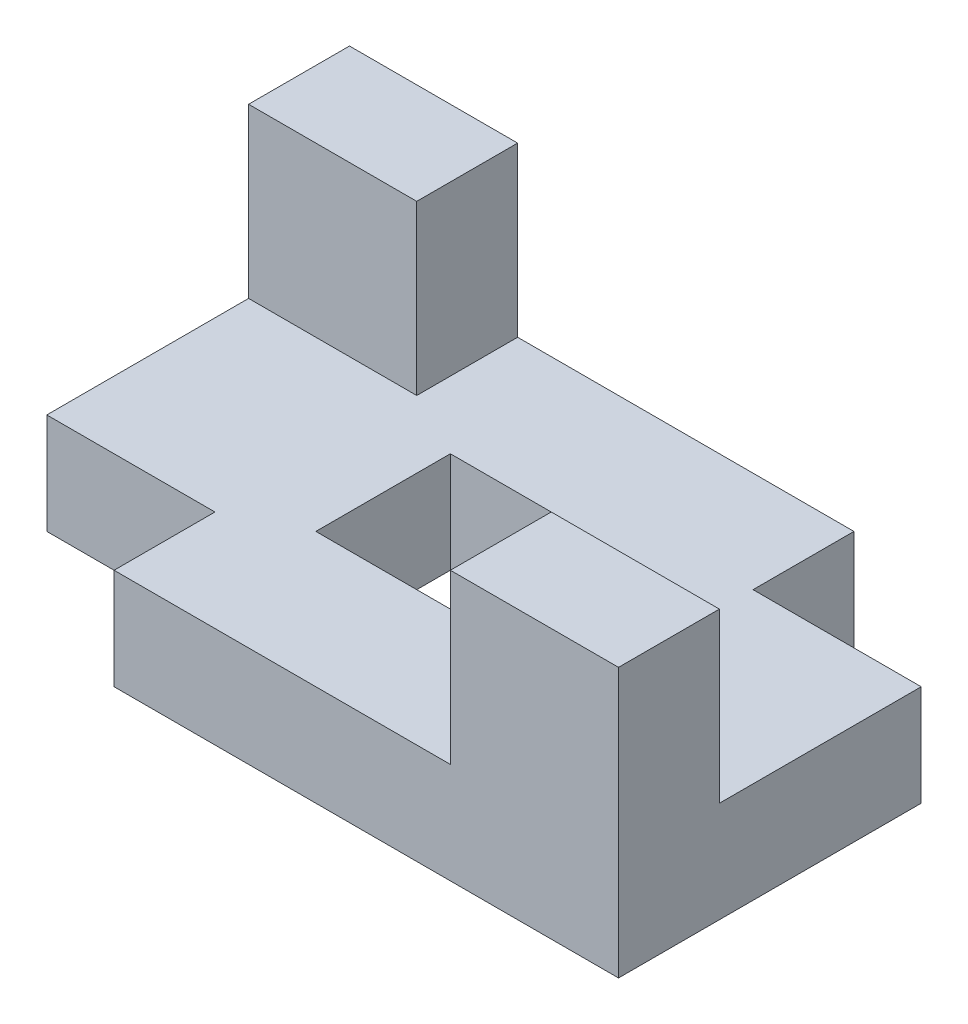
ISO-10303-21;
HEADER;
FILE_DESCRIPTION(('STEP AP214'),'2;1');
FILE_NAME('part.step','',(''),(''),'','','');
FILE_SCHEMA(('AUTOMOTIVE_DESIGN { 1 0 10303 214 1 1 1 1 }'));
ENDSEC;
DATA;
#1=APPLICATION_CONTEXT('core data for automotive mechanical design processes');
#2=APPLICATION_PROTOCOL_DEFINITION('international standard','automotive_design',2000,#1);
#3=PRODUCT_CONTEXT('',#1,'mechanical');
#4=PRODUCT('Part','Part','',(#3));
#5=PRODUCT_RELATED_PRODUCT_CATEGORY('part','',(#4));
#6=PRODUCT_DEFINITION_FORMATION('','',#4);
#7=PRODUCT_DEFINITION_CONTEXT('part definition',#1,'design');
#8=PRODUCT_DEFINITION('design','',#6,#7);
#9=PRODUCT_DEFINITION_SHAPE('','',#8);
#10=(LENGTH_UNIT() NAMED_UNIT(*) SI_UNIT(.MILLI.,.METRE.));
#11=(NAMED_UNIT(*) PLANE_ANGLE_UNIT() SI_UNIT($,.RADIAN.));
#12=(NAMED_UNIT(*) SI_UNIT($,.STERADIAN.) SOLID_ANGLE_UNIT());
#13=UNCERTAINTY_MEASURE_WITH_UNIT(LENGTH_MEASURE(1.E-05),#10,'distance_accuracy_value','');
#14=(GEOMETRIC_REPRESENTATION_CONTEXT(3) GLOBAL_UNCERTAINTY_ASSIGNED_CONTEXT((#13)) GLOBAL_UNIT_ASSIGNED_CONTEXT((#10,
#11,#12)) REPRESENTATION_CONTEXT('',''));
#15=CARTESIAN_POINT('',(0.,0.,0.));
#16=DIRECTION('',(0.,0.,1.));
#17=DIRECTION('',(1.,0.,0.));
#18=AXIS2_PLACEMENT_3D('',#15,#16,#17);
#19=CARTESIAN_POINT('',(-50.,15.,-30.));
#20=DIRECTION('',(1.,0.,0.));
#21=DIRECTION('',(0.,0.,-1.));
#22=AXIS2_PLACEMENT_3D('',#19,#20,#21);
#23=PLANE('',#22);
#24=DIRECTION('',(0.,0.,1.));
#25=VECTOR('',#24,1.);
#26=CARTESIAN_POINT('',(-50.,0.,-30.));
#27=LINE('',#26,#25);
#28=CARTESIAN_POINT('',(-50.,0.,-30.));
#29=VERTEX_POINT('',#28);
#30=CARTESIAN_POINT('',(-50.,0.,15.));
#31=VERTEX_POINT('',#30);
#32=EDGE_CURVE('E304',#29,#31,#27,.T.);
#33=ORIENTED_EDGE('',*,*,#32,.T.);
#34=DIRECTION('',(0.,1.,0.));
#35=VECTOR('',#34,1.);
#36=CARTESIAN_POINT('',(-50.,0.,15.));
#37=LINE('',#36,#35);
#38=CARTESIAN_POINT('',(-50.,15.,15.));
#39=VERTEX_POINT('',#38);
#40=EDGE_CURVE('E236',#31,#39,#37,.T.);
#41=ORIENTED_EDGE('',*,*,#40,.T.);
#42=DIRECTION('',(0.,0.,1.));
#43=VECTOR('',#42,1.);
#44=CARTESIAN_POINT('',(-50.,15.,-30.));
#45=LINE('',#44,#43);
#46=CARTESIAN_POINT('',(-50.,15.,-15.));
#47=VERTEX_POINT('',#46);
#48=EDGE_CURVE('E337',#47,#39,#45,.T.);
#49=ORIENTED_EDGE('',*,*,#48,.F.);
#50=DIRECTION('',(0.,-1.,0.));
#51=VECTOR('',#50,1.);
#52=CARTESIAN_POINT('',(-50.,40.,-15.));
#53=LINE('',#52,#51);
#54=CARTESIAN_POINT('',(-50.,40.,-15.));
#55=VERTEX_POINT('',#54);
#56=EDGE_CURVE('E300',#55,#47,#53,.T.);
#57=ORIENTED_EDGE('',*,*,#56,.F.);
#58=DIRECTION('',(0.,0.,1.));
#59=VECTOR('',#58,1.);
#60=CARTESIAN_POINT('',(-50.,40.,-30.));
#61=LINE('',#60,#59);
#62=CARTESIAN_POINT('',(-50.,40.,-30.));
#63=VERTEX_POINT('',#62);
#64=EDGE_CURVE('E269',#63,#55,#61,.T.);
#65=ORIENTED_EDGE('',*,*,#64,.F.);
#66=DIRECTION('',(0.,-1.,0.));
#67=VECTOR('',#66,1.);
#68=CARTESIAN_POINT('',(-50.,15.,-30.));
#69=LINE('',#68,#67);
#70=EDGE_CURVE('E53',#63,#29,#69,.T.);
#71=ORIENTED_EDGE('',*,*,#70,.T.);
#72=EDGE_LOOP('',(#33,#41,#49,#57,#65,#71));
#73=FACE_BOUND('',#72,.T.);
#74=ADVANCED_FACE('F45',(#73),#23,.F.);
#75=CARTESIAN_POINT('',(-50.,15.,30.));
#76=DIRECTION('',(0.,0.,-1.));
#77=DIRECTION('',(-1.,0.,0.));
#78=AXIS2_PLACEMENT_3D('',#75,#76,#77);
#79=PLANE('',#78);
#80=DIRECTION('',(1.,0.,0.));
#81=VECTOR('',#80,1.);
#82=CARTESIAN_POINT('',(-50.,15.,30.));
#83=LINE('',#82,#81);
#84=CARTESIAN_POINT('',(-25.,15.,30.));
#85=VERTEX_POINT('',#84);
#86=CARTESIAN_POINT('',(25.,15.,30.));
#87=VERTEX_POINT('',#86);
#88=EDGE_CURVE('E341',#85,#87,#83,.T.);
#89=ORIENTED_EDGE('',*,*,#88,.F.);
#90=DIRECTION('',(0.,1.,0.));
#91=VECTOR('',#90,1.);
#92=CARTESIAN_POINT('',(-25.,0.,30.));
#93=LINE('',#92,#91);
#94=CARTESIAN_POINT('',(-25.,0.,30.));
#95=VERTEX_POINT('',#94);
#96=EDGE_CURVE('E228',#95,#85,#93,.T.);
#97=ORIENTED_EDGE('',*,*,#96,.F.);
#98=DIRECTION('',(1.,0.,0.));
#99=VECTOR('',#98,1.);
#100=CARTESIAN_POINT('',(-50.,0.,30.));
#101=LINE('',#100,#99);
#102=CARTESIAN_POINT('',(50.,0.,30.));
#103=VERTEX_POINT('',#102);
#104=EDGE_CURVE('E355',#95,#103,#101,.T.);
#105=ORIENTED_EDGE('',*,*,#104,.T.);
#106=DIRECTION('',(0.,-1.,0.));
#107=VECTOR('',#106,1.);
#108=CARTESIAN_POINT('',(50.,15.,30.));
#109=LINE('',#108,#107);
#110=CARTESIAN_POINT('',(50.,40.,30.));
#111=VERTEX_POINT('',#110);
#112=EDGE_CURVE('E11',#111,#103,#109,.T.);
#113=ORIENTED_EDGE('',*,*,#112,.F.);
#114=DIRECTION('',(1.,0.,0.));
#115=VECTOR('',#114,1.);
#116=CARTESIAN_POINT('',(50.,40.,30.));
#117=LINE('',#116,#115);
#118=CARTESIAN_POINT('',(25.,40.,30.));
#119=VERTEX_POINT('',#118);
#120=EDGE_CURVE('E316',#119,#111,#117,.T.);
#121=ORIENTED_EDGE('',*,*,#120,.F.);
#122=DIRECTION('',(0.,-1.,0.));
#123=VECTOR('',#122,1.);
#124=CARTESIAN_POINT('',(25.,40.,30.));
#125=LINE('',#124,#123);
#126=EDGE_CURVE('E312',#119,#87,#125,.T.);
#127=ORIENTED_EDGE('',*,*,#126,.T.);
#128=EDGE_LOOP('',(#89,#97,#105,#113,#121,#127));
#129=FACE_BOUND('',#128,.T.);
#130=ADVANCED_FACE('F411',(#129),#79,.F.);
#131=CARTESIAN_POINT('',(50.,15.,-30.));
#132=DIRECTION('',(-1.,0.,0.));
#133=DIRECTION('',(0.,0.,1.));
#134=AXIS2_PLACEMENT_3D('',#131,#132,#133);
#135=PLANE('',#134);
#136=DIRECTION('',(0.,0.,-1.));
#137=VECTOR('',#136,1.);
#138=CARTESIAN_POINT('',(50.,0.,-30.));
#139=LINE('',#138,#137);
#140=CARTESIAN_POINT('',(50.,0.,-15.));
#141=VERTEX_POINT('',#140);
#142=EDGE_CURVE('E358',#103,#141,#139,.T.);
#143=ORIENTED_EDGE('',*,*,#142,.T.);
#144=DIRECTION('',(0.,1.,0.));
#145=VECTOR('',#144,1.);
#146=CARTESIAN_POINT('',(50.,0.,-15.));
#147=LINE('',#146,#145);
#148=CARTESIAN_POINT('',(50.,15.,-15.));
#149=VERTEX_POINT('',#148);
#150=EDGE_CURVE('E213',#141,#149,#147,.T.);
#151=ORIENTED_EDGE('',*,*,#150,.T.);
#152=DIRECTION('',(0.,0.,-1.));
#153=VECTOR('',#152,1.);
#154=CARTESIAN_POINT('',(50.,15.,-30.));
#155=LINE('',#154,#153);
#156=CARTESIAN_POINT('',(50.,15.,15.));
#157=VERTEX_POINT('',#156);
#158=EDGE_CURVE('E345',#157,#149,#155,.T.);
#159=ORIENTED_EDGE('',*,*,#158,.F.);
#160=DIRECTION('',(0.,-1.,0.));
#161=VECTOR('',#160,1.);
#162=CARTESIAN_POINT('',(50.,40.,15.));
#163=LINE('',#162,#161);
#164=CARTESIAN_POINT('',(50.,40.,15.));
#165=VERTEX_POINT('',#164);
#166=EDGE_CURVE('E240',#165,#157,#163,.T.);
#167=ORIENTED_EDGE('',*,*,#166,.F.);
#168=DIRECTION('',(0.,0.,-1.));
#169=VECTOR('',#168,1.);
#170=CARTESIAN_POINT('',(50.,40.,30.));
#171=LINE('',#170,#169);
#172=EDGE_CURVE('E321',#111,#165,#171,.T.);
#173=ORIENTED_EDGE('',*,*,#172,.F.);
#174=ORIENTED_EDGE('',*,*,#112,.T.);
#175=EDGE_LOOP('',(#143,#151,#159,#167,#173,#174));
#176=FACE_BOUND('',#175,.T.);
#177=ADVANCED_FACE('F405',(#176),#135,.F.);
#178=CARTESIAN_POINT('',(-50.,15.,-30.));
#179=DIRECTION('',(0.,0.,1.));
#180=DIRECTION('',(1.,0.,0.));
#181=AXIS2_PLACEMENT_3D('',#178,#179,#180);
#182=PLANE('',#181);
#183=DIRECTION('',(-1.,0.,0.));
#184=VECTOR('',#183,1.);
#185=CARTESIAN_POINT('',(-50.,15.,-30.));
#186=LINE('',#185,#184);
#187=CARTESIAN_POINT('',(25.,15.,-30.));
#188=VERTEX_POINT('',#187);
#189=CARTESIAN_POINT('',(-25.,15.,-30.));
#190=VERTEX_POINT('',#189);
#191=EDGE_CURVE('E349',#188,#190,#186,.T.);
#192=ORIENTED_EDGE('',*,*,#191,.F.);
#193=DIRECTION('',(0.,1.,0.));
#194=VECTOR('',#193,1.);
#195=CARTESIAN_POINT('',(25.,0.,-30.));
#196=LINE('',#195,#194);
#197=CARTESIAN_POINT('',(25.,0.,-30.));
#198=VERTEX_POINT('',#197);
#199=EDGE_CURVE('E246',#198,#188,#196,.T.);
#200=ORIENTED_EDGE('',*,*,#199,.F.);
#201=DIRECTION('',(-1.,0.,0.));
#202=VECTOR('',#201,1.);
#203=CARTESIAN_POINT('',(-50.,0.,-30.));
#204=LINE('',#203,#202);
#205=EDGE_CURVE('E342',#198,#29,#204,.T.);
#206=ORIENTED_EDGE('',*,*,#205,.T.);
#207=ORIENTED_EDGE('',*,*,#70,.F.);
#208=DIRECTION('',(-1.,0.,0.));
#209=VECTOR('',#208,1.);
#210=CARTESIAN_POINT('',(-50.,40.,-30.));
#211=LINE('',#210,#209);
#212=CARTESIAN_POINT('',(-25.,40.,-30.));
#213=VERTEX_POINT('',#212);
#214=EDGE_CURVE('E280',#213,#63,#211,.T.);
#215=ORIENTED_EDGE('',*,*,#214,.F.);
#216=DIRECTION('',(0.,-1.,0.));
#217=VECTOR('',#216,1.);
#218=CARTESIAN_POINT('',(-25.,40.,-30.));
#219=LINE('',#218,#217);
#220=EDGE_CURVE('E284',#213,#190,#219,.T.);
#221=ORIENTED_EDGE('',*,*,#220,.T.);
#222=EDGE_LOOP('',(#192,#200,#206,#207,#215,#221));
#223=FACE_BOUND('',#222,.T.);
#224=ADVANCED_FACE('F393',(#223),#182,.F.);
#225=CARTESIAN_POINT('',(0.,15.,0.));
#226=DIRECTION('',(0.,1.,0.));
#227=DIRECTION('',(0.,0.,1.));
#228=AXIS2_PLACEMENT_3D('',#225,#226,#227);
#229=PLANE('',#228);
#230=DIRECTION('',(0.,0.,1.));
#231=VECTOR('',#230,1.);
#232=CARTESIAN_POINT('',(-15.,15.,-10.));
#233=LINE('',#232,#231);
#234=CARTESIAN_POINT('',(-15.,15.,-10.));
#235=VERTEX_POINT('',#234);
#236=CARTESIAN_POINT('',(-15.,15.,9.99999999999999));
#237=VERTEX_POINT('',#236);
#238=EDGE_CURVE('E60',#235,#237,#233,.T.);
#239=ORIENTED_EDGE('',*,*,#238,.F.);
#240=DIRECTION('',(-1.,0.,0.));
#241=VECTOR('',#240,1.);
#242=CARTESIAN_POINT('',(-15.,15.,-10.));
#243=LINE('',#242,#241);
#244=CARTESIAN_POINT('',(15.,15.,-10.));
#245=VERTEX_POINT('',#244);
#246=EDGE_CURVE('E191',#245,#235,#243,.T.);
#247=ORIENTED_EDGE('',*,*,#246,.F.);
#248=DIRECTION('',(0.,0.,-1.));
#249=VECTOR('',#248,1.);
#250=CARTESIAN_POINT('',(15.,15.,-10.));
#251=LINE('',#250,#249);
#252=CARTESIAN_POINT('',(15.,15.,9.99999999999999));
#253=VERTEX_POINT('',#252);
#254=EDGE_CURVE('E195',#253,#245,#251,.T.);
#255=ORIENTED_EDGE('',*,*,#254,.F.);
#256=DIRECTION('',(1.,0.,0.));
#257=VECTOR('',#256,1.);
#258=CARTESIAN_POINT('',(-15.,15.,9.99999999999999));
#259=LINE('',#258,#257);
#260=EDGE_CURVE('E204',#237,#253,#259,.T.);
#261=ORIENTED_EDGE('',*,*,#260,.F.);
#262=EDGE_LOOP('',(#239,#247,#255,#261));
#263=FACE_BOUND('',#262,.T.);
#264=DIRECTION('',(-1.,0.,0.));
#265=VECTOR('',#264,1.);
#266=CARTESIAN_POINT('',(-50.,15.,15.));
#267=LINE('',#266,#265);
#268=CARTESIAN_POINT('',(-25.,15.,15.));
#269=VERTEX_POINT('',#268);
#270=EDGE_CURVE('E224',#269,#39,#267,.T.);
#271=ORIENTED_EDGE('',*,*,#270,.F.);
#272=DIRECTION('',(0.,0.,-1.));
#273=VECTOR('',#272,1.);
#274=CARTESIAN_POINT('',(-25.,15.,30.));
#275=LINE('',#274,#273);
#276=EDGE_CURVE('E229',#85,#269,#275,.T.);
#277=ORIENTED_EDGE('',*,*,#276,.F.);
#278=ORIENTED_EDGE('',*,*,#88,.T.);
#279=DIRECTION('',(0.,0.,1.));
#280=VECTOR('',#279,1.);
#281=CARTESIAN_POINT('',(25.,15.,30.));
#282=LINE('',#281,#280);
#283=CARTESIAN_POINT('',(25.,15.,15.));
#284=VERTEX_POINT('',#283);
#285=EDGE_CURVE('E317',#284,#87,#282,.T.);
#286=ORIENTED_EDGE('',*,*,#285,.F.);
#287=DIRECTION('',(-1.,0.,0.));
#288=VECTOR('',#287,1.);
#289=CARTESIAN_POINT('',(50.,15.,15.));
#290=LINE('',#289,#288);
#291=EDGE_CURVE('E289',#157,#284,#290,.T.);
#292=ORIENTED_EDGE('',*,*,#291,.F.);
#293=ORIENTED_EDGE('',*,*,#158,.T.);
#294=DIRECTION('',(1.,0.,0.));
#295=VECTOR('',#294,1.);
#296=CARTESIAN_POINT('',(50.,15.,-15.));
#297=LINE('',#296,#295);
#298=CARTESIAN_POINT('',(25.,15.,-15.));
#299=VERTEX_POINT('',#298);
#300=EDGE_CURVE('E256',#299,#149,#297,.T.);
#301=ORIENTED_EDGE('',*,*,#300,.F.);
#302=DIRECTION('',(0.,0.,1.));
#303=VECTOR('',#302,1.);
#304=CARTESIAN_POINT('',(25.,15.,-30.));
#305=LINE('',#304,#303);
#306=EDGE_CURVE('E233',#188,#299,#305,.T.);
#307=ORIENTED_EDGE('',*,*,#306,.F.);
#308=ORIENTED_EDGE('',*,*,#191,.T.);
#309=DIRECTION('',(0.,0.,-1.));
#310=VECTOR('',#309,1.);
#311=CARTESIAN_POINT('',(-25.,15.,-30.));
#312=LINE('',#311,#310);
#313=CARTESIAN_POINT('',(-25.,15.,-15.));
#314=VERTEX_POINT('',#313);
#315=EDGE_CURVE('E274',#314,#190,#312,.T.);
#316=ORIENTED_EDGE('',*,*,#315,.F.);
#317=DIRECTION('',(1.,0.,0.));
#318=VECTOR('',#317,1.);
#319=CARTESIAN_POINT('',(-50.,15.,-15.));
#320=LINE('',#319,#318);
#321=EDGE_CURVE('E285',#47,#314,#320,.T.);
#322=ORIENTED_EDGE('',*,*,#321,.F.);
#323=ORIENTED_EDGE('',*,*,#48,.T.);
#324=EDGE_LOOP('',(#271,#277,#278,#286,#292,#293,#301,#307,#308,#316,#322,#323));
#325=FACE_BOUND('',#324,.T.);
#326=ADVANCED_FACE('F383',(#263,#325),#229,.T.);
#327=CARTESIAN_POINT('',(0.,0.,0.));
#328=DIRECTION('',(0.,1.,0.));
#329=DIRECTION('',(0.,0.,1.));
#330=AXIS2_PLACEMENT_3D('',#327,#328,#329);
#331=PLANE('',#330);
#332=DIRECTION('',(-1.,0.,0.));
#333=VECTOR('',#332,1.);
#334=CARTESIAN_POINT('',(-15.,0.,-10.));
#335=LINE('',#334,#333);
#336=CARTESIAN_POINT('',(15.,0.,-10.));
#337=VERTEX_POINT('',#336);
#338=CARTESIAN_POINT('',(-15.,0.,-10.));
#339=VERTEX_POINT('',#338);
#340=EDGE_CURVE('E179',#337,#339,#335,.T.);
#341=ORIENTED_EDGE('',*,*,#340,.T.);
#342=DIRECTION('',(0.,0.,1.));
#343=VECTOR('',#342,1.);
#344=CARTESIAN_POINT('',(-15.,0.,-10.));
#345=LINE('',#344,#343);
#346=CARTESIAN_POINT('',(-15.,0.,9.99999999999999));
#347=VERTEX_POINT('',#346);
#348=EDGE_CURVE('E172',#339,#347,#345,.T.);
#349=ORIENTED_EDGE('',*,*,#348,.T.);
#350=DIRECTION('',(1.,0.,0.));
#351=VECTOR('',#350,1.);
#352=CARTESIAN_POINT('',(-15.,0.,9.99999999999999));
#353=LINE('',#352,#351);
#354=CARTESIAN_POINT('',(15.,0.,9.99999999999999));
#355=VERTEX_POINT('',#354);
#356=EDGE_CURVE('E182',#347,#355,#353,.T.);
#357=ORIENTED_EDGE('',*,*,#356,.T.);
#358=DIRECTION('',(0.,0.,-1.));
#359=VECTOR('',#358,1.);
#360=CARTESIAN_POINT('',(15.,0.,-10.));
#361=LINE('',#360,#359);
#362=EDGE_CURVE('E68',#355,#337,#361,.T.);
#363=ORIENTED_EDGE('',*,*,#362,.T.);
#364=EDGE_LOOP('',(#341,#349,#357,#363));
#365=FACE_BOUND('',#364,.T.);
#366=DIRECTION('',(0.,0.,-1.));
#367=VECTOR('',#366,1.);
#368=CARTESIAN_POINT('',(-25.,0.,30.));
#369=LINE('',#368,#367);
#370=CARTESIAN_POINT('',(-25.,0.,15.));
#371=VERTEX_POINT('',#370);
#372=EDGE_CURVE('E219',#95,#371,#369,.T.);
#373=ORIENTED_EDGE('',*,*,#372,.T.);
#374=DIRECTION('',(-1.,0.,0.));
#375=VECTOR('',#374,1.);
#376=CARTESIAN_POINT('',(-50.,0.,15.));
#377=LINE('',#376,#375);
#378=EDGE_CURVE('E223',#371,#31,#377,.T.);
#379=ORIENTED_EDGE('',*,*,#378,.T.);
#380=ORIENTED_EDGE('',*,*,#32,.F.);
#381=ORIENTED_EDGE('',*,*,#205,.F.);
#382=DIRECTION('',(0.,0.,1.));
#383=VECTOR('',#382,1.);
#384=CARTESIAN_POINT('',(25.,0.,-30.));
#385=LINE('',#384,#383);
#386=CARTESIAN_POINT('',(25.,0.,-15.));
#387=VERTEX_POINT('',#386);
#388=EDGE_CURVE('E259',#198,#387,#385,.T.);
#389=ORIENTED_EDGE('',*,*,#388,.T.);
#390=DIRECTION('',(1.,0.,0.));
#391=VECTOR('',#390,1.);
#392=CARTESIAN_POINT('',(50.,0.,-15.));
#393=LINE('',#392,#391);
#394=EDGE_CURVE('E249',#387,#141,#393,.T.);
#395=ORIENTED_EDGE('',*,*,#394,.T.);
#396=ORIENTED_EDGE('',*,*,#142,.F.);
#397=ORIENTED_EDGE('',*,*,#104,.F.);
#398=EDGE_LOOP('',(#373,#379,#380,#381,#389,#395,#396,#397));
#399=FACE_BOUND('',#398,.T.);
#400=ADVANCED_FACE('F187',(#365,#399),#331,.F.);
#401=CARTESIAN_POINT('',(50.,40.,15.));
#402=DIRECTION('',(0.,0.,1.));
#403=DIRECTION('',(1.,0.,0.));
#404=AXIS2_PLACEMENT_3D('',#401,#402,#403);
#405=PLANE('',#404);
#406=ORIENTED_EDGE('',*,*,#291,.T.);
#407=DIRECTION('',(0.,-1.,0.));
#408=VECTOR('',#407,1.);
#409=CARTESIAN_POINT('',(25.,40.,15.));
#410=LINE('',#409,#408);
#411=CARTESIAN_POINT('',(25.,40.,15.));
#412=VERTEX_POINT('',#411);
#413=EDGE_CURVE('E308',#412,#284,#410,.T.);
#414=ORIENTED_EDGE('',*,*,#413,.F.);
#415=DIRECTION('',(-1.,0.,0.));
#416=VECTOR('',#415,1.);
#417=CARTESIAN_POINT('',(50.,40.,15.));
#418=LINE('',#417,#416);
#419=EDGE_CURVE('E331',#165,#412,#418,.T.);
#420=ORIENTED_EDGE('',*,*,#419,.F.);
#421=ORIENTED_EDGE('',*,*,#166,.T.);
#422=EDGE_LOOP('',(#406,#414,#420,#421));
#423=FACE_BOUND('',#422,.T.);
#424=ADVANCED_FACE('F420',(#423),#405,.F.);
#425=CARTESIAN_POINT('',(25.,40.,30.));
#426=DIRECTION('',(1.,0.,0.));
#427=DIRECTION('',(0.,0.,-1.));
#428=AXIS2_PLACEMENT_3D('',#425,#426,#427);
#429=PLANE('',#428);
#430=ORIENTED_EDGE('',*,*,#285,.T.);
#431=ORIENTED_EDGE('',*,*,#126,.F.);
#432=DIRECTION('',(0.,0.,1.));
#433=VECTOR('',#432,1.);
#434=CARTESIAN_POINT('',(25.,40.,30.));
#435=LINE('',#434,#433);
#436=EDGE_CURVE('E328',#412,#119,#435,.T.);
#437=ORIENTED_EDGE('',*,*,#436,.F.);
#438=ORIENTED_EDGE('',*,*,#413,.T.);
#439=EDGE_LOOP('',(#430,#431,#437,#438));
#440=FACE_BOUND('',#439,.T.);
#441=ADVANCED_FACE('F418',(#440),#429,.F.);
#442=CARTESIAN_POINT('',(0.,40.,0.));
#443=DIRECTION('',(0.,1.,0.));
#444=DIRECTION('',(0.,0.,1.));
#445=AXIS2_PLACEMENT_3D('',#442,#443,#444);
#446=PLANE('',#445);
#447=ORIENTED_EDGE('',*,*,#172,.T.);
#448=ORIENTED_EDGE('',*,*,#419,.T.);
#449=ORIENTED_EDGE('',*,*,#436,.T.);
#450=ORIENTED_EDGE('',*,*,#120,.T.);
#451=EDGE_LOOP('',(#447,#448,#449,#450));
#452=FACE_BOUND('',#451,.T.);
#453=ADVANCED_FACE('F413',(#452),#446,.T.);
#454=CARTESIAN_POINT('',(-50.,40.,-15.));
#455=DIRECTION('',(0.,0.,-1.));
#456=DIRECTION('',(-1.,0.,0.));
#457=AXIS2_PLACEMENT_3D('',#454,#455,#456);
#458=PLANE('',#457);
#459=ORIENTED_EDGE('',*,*,#321,.T.);
#460=DIRECTION('',(0.,-1.,0.));
#461=VECTOR('',#460,1.);
#462=CARTESIAN_POINT('',(-25.,40.,-15.));
#463=LINE('',#462,#461);
#464=CARTESIAN_POINT('',(-25.,40.,-15.));
#465=VERTEX_POINT('',#464);
#466=EDGE_CURVE('E296',#465,#314,#463,.T.);
#467=ORIENTED_EDGE('',*,*,#466,.F.);
#468=DIRECTION('',(1.,0.,0.));
#469=VECTOR('',#468,1.);
#470=CARTESIAN_POINT('',(-50.,40.,-15.));
#471=LINE('',#470,#469);
#472=EDGE_CURVE('E273',#55,#465,#471,.T.);
#473=ORIENTED_EDGE('',*,*,#472,.F.);
#474=ORIENTED_EDGE('',*,*,#56,.T.);
#475=EDGE_LOOP('',(#459,#467,#473,#474));
#476=FACE_BOUND('',#475,.T.);
#477=ADVANCED_FACE('F386',(#476),#458,.F.);
#478=CARTESIAN_POINT('',(-25.,40.,-30.));
#479=DIRECTION('',(-1.,0.,0.));
#480=DIRECTION('',(0.,0.,1.));
#481=AXIS2_PLACEMENT_3D('',#478,#479,#480);
#482=PLANE('',#481);
#483=ORIENTED_EDGE('',*,*,#315,.T.);
#484=ORIENTED_EDGE('',*,*,#220,.F.);
#485=DIRECTION('',(0.,0.,-1.));
#486=VECTOR('',#485,1.);
#487=CARTESIAN_POINT('',(-25.,40.,-30.));
#488=LINE('',#487,#486);
#489=EDGE_CURVE('E277',#465,#213,#488,.T.);
#490=ORIENTED_EDGE('',*,*,#489,.F.);
#491=ORIENTED_EDGE('',*,*,#466,.T.);
#492=EDGE_LOOP('',(#483,#484,#490,#491));
#493=FACE_BOUND('',#492,.T.);
#494=ADVANCED_FACE('F396',(#493),#482,.F.);
#495=CARTESIAN_POINT('',(0.,40.,0.));
#496=DIRECTION('',(0.,1.,0.));
#497=DIRECTION('',(0.,0.,1.));
#498=AXIS2_PLACEMENT_3D('',#495,#496,#497);
#499=PLANE('',#498);
#500=ORIENTED_EDGE('',*,*,#64,.T.);
#501=ORIENTED_EDGE('',*,*,#472,.T.);
#502=ORIENTED_EDGE('',*,*,#489,.T.);
#503=ORIENTED_EDGE('',*,*,#214,.T.);
#504=EDGE_LOOP('',(#500,#501,#502,#503));
#505=FACE_BOUND('',#504,.T.);
#506=ADVANCED_FACE('F390',(#505),#499,.T.);
#507=CARTESIAN_POINT('',(50.,0.,-15.));
#508=DIRECTION('',(0.,0.,1.));
#509=DIRECTION('',(1.,0.,0.));
#510=AXIS2_PLACEMENT_3D('',#507,#508,#509);
#511=PLANE('',#510);
#512=ORIENTED_EDGE('',*,*,#300,.T.);
#513=ORIENTED_EDGE('',*,*,#150,.F.);
#514=ORIENTED_EDGE('',*,*,#394,.F.);
#515=DIRECTION('',(0.,1.,0.));
#516=VECTOR('',#515,1.);
#517=CARTESIAN_POINT('',(25.,0.,-15.));
#518=LINE('',#517,#516);
#519=EDGE_CURVE('E250',#387,#299,#518,.T.);
#520=ORIENTED_EDGE('',*,*,#519,.T.);
#521=EDGE_LOOP('',(#512,#513,#514,#520));
#522=FACE_BOUND('',#521,.T.);
#523=ADVANCED_FACE('F455',(#522),#511,.F.);
#524=CARTESIAN_POINT('',(25.,0.,-30.));
#525=DIRECTION('',(-1.,0.,0.));
#526=DIRECTION('',(0.,0.,1.));
#527=AXIS2_PLACEMENT_3D('',#524,#525,#526);
#528=PLANE('',#527);
#529=ORIENTED_EDGE('',*,*,#306,.T.);
#530=ORIENTED_EDGE('',*,*,#519,.F.);
#531=ORIENTED_EDGE('',*,*,#388,.F.);
#532=ORIENTED_EDGE('',*,*,#199,.T.);
#533=EDGE_LOOP('',(#529,#530,#531,#532));
#534=FACE_BOUND('',#533,.T.);
#535=ADVANCED_FACE('F401',(#534),#528,.F.);
#536=CARTESIAN_POINT('',(-50.,0.,15.));
#537=DIRECTION('',(0.,0.,-1.));
#538=DIRECTION('',(-1.,0.,0.));
#539=AXIS2_PLACEMENT_3D('',#536,#537,#538);
#540=PLANE('',#539);
#541=ORIENTED_EDGE('',*,*,#270,.T.);
#542=ORIENTED_EDGE('',*,*,#40,.F.);
#543=ORIENTED_EDGE('',*,*,#378,.F.);
#544=DIRECTION('',(0.,1.,0.));
#545=VECTOR('',#544,1.);
#546=CARTESIAN_POINT('',(-25.,0.,15.));
#547=LINE('',#546,#545);
#548=EDGE_CURVE('E241',#371,#269,#547,.T.);
#549=ORIENTED_EDGE('',*,*,#548,.T.);
#550=EDGE_LOOP('',(#541,#542,#543,#549));
#551=FACE_BOUND('',#550,.T.);
#552=ADVANCED_FACE('F375',(#551),#540,.F.);
#553=CARTESIAN_POINT('',(-25.,0.,30.));
#554=DIRECTION('',(1.,0.,0.));
#555=DIRECTION('',(0.,0.,-1.));
#556=AXIS2_PLACEMENT_3D('',#553,#554,#555);
#557=PLANE('',#556);
#558=ORIENTED_EDGE('',*,*,#276,.T.);
#559=ORIENTED_EDGE('',*,*,#548,.F.);
#560=ORIENTED_EDGE('',*,*,#372,.F.);
#561=ORIENTED_EDGE('',*,*,#96,.T.);
#562=EDGE_LOOP('',(#558,#559,#560,#561));
#563=FACE_BOUND('',#562,.T.);
#564=ADVANCED_FACE('F377',(#563),#557,.F.);
#565=CARTESIAN_POINT('',(-15.,0.,-10.));
#566=DIRECTION('',(-1.,0.,0.));
#567=DIRECTION('',(0.,0.,1.));
#568=AXIS2_PLACEMENT_3D('',#565,#566,#567);
#569=PLANE('',#568);
#570=ORIENTED_EDGE('',*,*,#238,.T.);
#571=DIRECTION('',(0.,1.,0.));
#572=VECTOR('',#571,1.);
#573=CARTESIAN_POINT('',(-15.,0.,9.99999999999999));
#574=LINE('',#573,#572);
#575=EDGE_CURVE('E168',#347,#237,#574,.T.);
#576=ORIENTED_EDGE('',*,*,#575,.F.);
#577=ORIENTED_EDGE('',*,*,#348,.F.);
#578=DIRECTION('',(0.,1.,0.));
#579=VECTOR('',#578,1.);
#580=CARTESIAN_POINT('',(-15.,0.,-10.));
#581=LINE('',#580,#579);
#582=EDGE_CURVE('E210',#339,#235,#581,.T.);
#583=ORIENTED_EDGE('',*,*,#582,.T.);
#584=EDGE_LOOP('',(#570,#576,#577,#583));
#585=FACE_BOUND('',#584,.T.);
#586=ADVANCED_FACE('F170',(#585),#569,.F.);
#587=CARTESIAN_POINT('',(-15.,0.,-10.));
#588=DIRECTION('',(0.,0.,-1.));
#589=DIRECTION('',(-1.,0.,0.));
#590=AXIS2_PLACEMENT_3D('',#587,#588,#589);
#591=PLANE('',#590);
#592=ORIENTED_EDGE('',*,*,#246,.T.);
#593=ORIENTED_EDGE('',*,*,#582,.F.);
#594=ORIENTED_EDGE('',*,*,#340,.F.);
#595=DIRECTION('',(0.,1.,0.));
#596=VECTOR('',#595,1.);
#597=CARTESIAN_POINT('',(15.,0.,-10.));
#598=LINE('',#597,#596);
#599=EDGE_CURVE('E214',#337,#245,#598,.T.);
#600=ORIENTED_EDGE('',*,*,#599,.T.);
#601=EDGE_LOOP('',(#592,#593,#594,#600));
#602=FACE_BOUND('',#601,.T.);
#603=ADVANCED_FACE('F466',(#602),#591,.F.);
#604=CARTESIAN_POINT('',(15.,0.,-10.));
#605=DIRECTION('',(1.,0.,0.));
#606=DIRECTION('',(0.,0.,-1.));
#607=AXIS2_PLACEMENT_3D('',#604,#605,#606);
#608=PLANE('',#607);
#609=ORIENTED_EDGE('',*,*,#254,.T.);
#610=ORIENTED_EDGE('',*,*,#599,.F.);
#611=ORIENTED_EDGE('',*,*,#362,.F.);
#612=DIRECTION('',(0.,1.,0.));
#613=VECTOR('',#612,1.);
#614=CARTESIAN_POINT('',(15.,0.,9.99999999999999));
#615=LINE('',#614,#613);
#616=EDGE_CURVE('E178',#355,#253,#615,.T.);
#617=ORIENTED_EDGE('',*,*,#616,.T.);
#618=EDGE_LOOP('',(#609,#610,#611,#617));
#619=FACE_BOUND('',#618,.T.);
#620=ADVANCED_FACE('F469',(#619),#608,.F.);
#621=CARTESIAN_POINT('',(-15.,0.,9.99999999999999));
#622=DIRECTION('',(0.,0.,1.));
#623=DIRECTION('',(1.,0.,0.));
#624=AXIS2_PLACEMENT_3D('',#621,#622,#623);
#625=PLANE('',#624);
#626=ORIENTED_EDGE('',*,*,#260,.T.);
#627=ORIENTED_EDGE('',*,*,#616,.F.);
#628=ORIENTED_EDGE('',*,*,#356,.F.);
#629=ORIENTED_EDGE('',*,*,#575,.T.);
#630=EDGE_LOOP('',(#626,#627,#628,#629));
#631=FACE_BOUND('',#630,.T.);
#632=ADVANCED_FACE('F183',(#631),#625,.F.);
#633=CLOSED_SHELL('',(#74,#130,#177,#224,#326,#400,#424,#441,#453,#477,#494,#506,#523,#535,#552,
#564,#586,#603,#620,#632));
#634=MANIFOLD_SOLID_BREP('B2',#633);
#635=ADVANCED_BREP_SHAPE_REPRESENTATION('',(#18,#634),#14);
#636=SHAPE_DEFINITION_REPRESENTATION(#9,#635);
ENDSEC;
END-ISO-10303-21;
